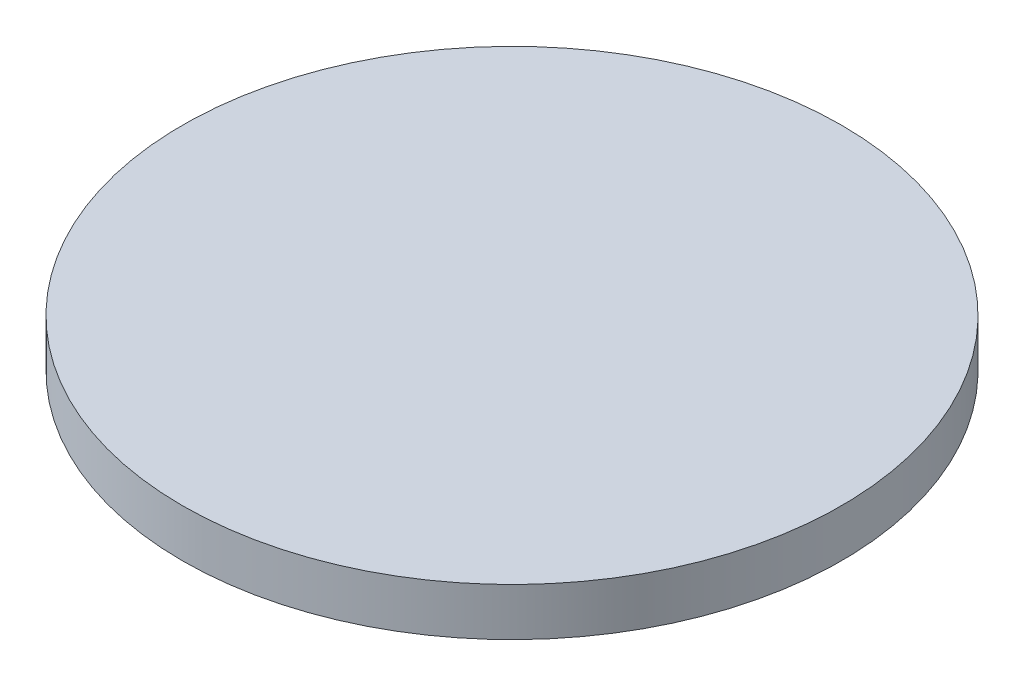
ISO-10303-21;
HEADER;
FILE_DESCRIPTION(('STEP AP214'),'2;1');
FILE_NAME('part.step','',(''),(''),'','','');
FILE_SCHEMA(('AUTOMOTIVE_DESIGN { 1 0 10303 214 1 1 1 1 }'));
ENDSEC;
DATA;
#1=APPLICATION_CONTEXT('core data for automotive mechanical design processes');
#2=APPLICATION_PROTOCOL_DEFINITION('international standard','automotive_design',2000,#1);
#3=PRODUCT_CONTEXT('',#1,'mechanical');
#4=PRODUCT('Part','Part','',(#3));
#5=PRODUCT_RELATED_PRODUCT_CATEGORY('part','',(#4));
#6=PRODUCT_DEFINITION_FORMATION('','',#4);
#7=PRODUCT_DEFINITION_CONTEXT('part definition',#1,'design');
#8=PRODUCT_DEFINITION('design','',#6,#7);
#9=PRODUCT_DEFINITION_SHAPE('','',#8);
#10=(LENGTH_UNIT() NAMED_UNIT(*) SI_UNIT(.MILLI.,.METRE.));
#11=(NAMED_UNIT(*) PLANE_ANGLE_UNIT() SI_UNIT($,.RADIAN.));
#12=(NAMED_UNIT(*) SI_UNIT($,.STERADIAN.) SOLID_ANGLE_UNIT());
#13=UNCERTAINTY_MEASURE_WITH_UNIT(LENGTH_MEASURE(1.E-05),#10,'distance_accuracy_value','');
#14=(GEOMETRIC_REPRESENTATION_CONTEXT(3) GLOBAL_UNCERTAINTY_ASSIGNED_CONTEXT((#13)) GLOBAL_UNIT_ASSIGNED_CONTEXT((#10,
#11,#12)) REPRESENTATION_CONTEXT('',''));
#15=CARTESIAN_POINT('',(0.,0.,0.));
#16=DIRECTION('',(0.,0.,1.));
#17=DIRECTION('',(1.,0.,0.));
#18=AXIS2_PLACEMENT_3D('',#15,#16,#17);
#19=CARTESIAN_POINT('',(0.,1.,0.));
#20=DIRECTION('',(0.,-1.,0.));
#21=DIRECTION('',(0.,0.,-1.));
#22=AXIS2_PLACEMENT_3D('',#19,#20,#21);
#23=CYLINDRICAL_SURFACE('',#22,6.9);
#24=CARTESIAN_POINT('',(0.,1.,0.));
#25=DIRECTION('',(0.,1.,0.));
#26=DIRECTION('',(0.,0.,1.));
#27=AXIS2_PLACEMENT_3D('',#24,#25,#26);
#28=CIRCLE('',#27,6.9);
#29=CARTESIAN_POINT('',(0.,1.,6.9));
#30=VERTEX_POINT('',#29);
#31=EDGE_CURVE('E10',#30,#30,#28,.T.);
#32=ORIENTED_EDGE('',*,*,#31,.F.);
#33=EDGE_LOOP('',(#32));
#34=FACE_BOUND('',#33,.T.);
#35=CARTESIAN_POINT('',(0.,0.,0.));
#36=DIRECTION('',(0.,1.,0.));
#37=DIRECTION('',(0.,0.,1.));
#38=AXIS2_PLACEMENT_3D('',#35,#36,#37);
#39=CIRCLE('',#38,6.9);
#40=CARTESIAN_POINT('',(0.,0.,6.9));
#41=VERTEX_POINT('',#40);
#42=EDGE_CURVE('E34',#41,#41,#39,.T.);
#43=ORIENTED_EDGE('',*,*,#42,.T.);
#44=EDGE_LOOP('',(#43));
#45=FACE_BOUND('',#44,.T.);
#46=ADVANCED_FACE('F31',(#34,#45),#23,.T.);
#47=CARTESIAN_POINT('',(0.,1.,0.));
#48=DIRECTION('',(0.,1.,0.));
#49=DIRECTION('',(0.,0.,1.));
#50=AXIS2_PLACEMENT_3D('',#47,#48,#49);
#51=PLANE('',#50);
#52=ORIENTED_EDGE('',*,*,#31,.T.);
#53=EDGE_LOOP('',(#52));
#54=FACE_BOUND('',#53,.T.);
#55=ADVANCED_FACE('F46',(#54),#51,.T.);
#56=CARTESIAN_POINT('',(0.,0.,0.));
#57=DIRECTION('',(0.,1.,0.));
#58=DIRECTION('',(0.,0.,1.));
#59=AXIS2_PLACEMENT_3D('',#56,#57,#58);
#60=PLANE('',#59);
#61=ORIENTED_EDGE('',*,*,#42,.F.);
#62=EDGE_LOOP('',(#61));
#63=FACE_BOUND('',#62,.T.);
#64=ADVANCED_FACE('F44',(#63),#60,.F.);
#65=CLOSED_SHELL('',(#46,#55,#64));
#66=MANIFOLD_SOLID_BREP('B2',#65);
#67=ADVANCED_BREP_SHAPE_REPRESENTATION('',(#18,#66),#14);
#68=SHAPE_DEFINITION_REPRESENTATION(#9,#67);
ENDSEC;
END-ISO-10303-21;
